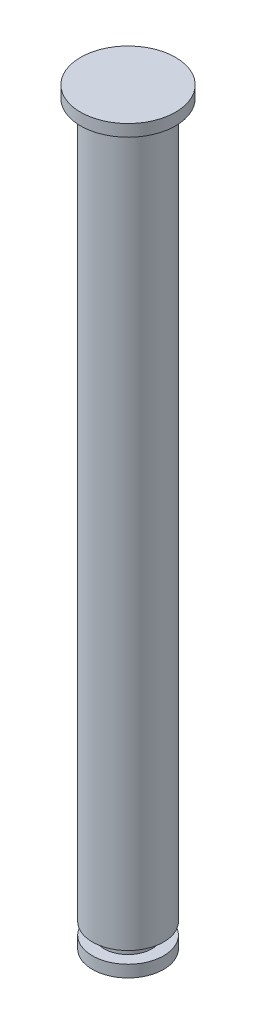
ISO-10303-21;
HEADER;
FILE_DESCRIPTION(('STEP AP214'),'2;1');
FILE_NAME('part.step','',(''),(''),'','','');
FILE_SCHEMA(('AUTOMOTIVE_DESIGN { 1 0 10303 214 1 1 1 1 }'));
ENDSEC;
DATA;
#1=APPLICATION_CONTEXT('core data for automotive mechanical design processes');
#2=APPLICATION_PROTOCOL_DEFINITION('international standard','automotive_design',2000,#1);
#3=PRODUCT_CONTEXT('',#1,'mechanical');
#4=PRODUCT('Part','Part','',(#3));
#5=PRODUCT_RELATED_PRODUCT_CATEGORY('part','',(#4));
#6=PRODUCT_DEFINITION_FORMATION('','',#4);
#7=PRODUCT_DEFINITION_CONTEXT('part definition',#1,'design');
#8=PRODUCT_DEFINITION('design','',#6,#7);
#9=PRODUCT_DEFINITION_SHAPE('','',#8);
#10=(LENGTH_UNIT() NAMED_UNIT(*) SI_UNIT(.MILLI.,.METRE.));
#11=(NAMED_UNIT(*) PLANE_ANGLE_UNIT() SI_UNIT($,.RADIAN.));
#12=(NAMED_UNIT(*) SI_UNIT($,.STERADIAN.) SOLID_ANGLE_UNIT());
#13=UNCERTAINTY_MEASURE_WITH_UNIT(LENGTH_MEASURE(1.E-05),#10,'distance_accuracy_value','');
#14=(GEOMETRIC_REPRESENTATION_CONTEXT(3) GLOBAL_UNCERTAINTY_ASSIGNED_CONTEXT((#13)) GLOBAL_UNIT_ASSIGNED_CONTEXT((#10,
#11,#12)) REPRESENTATION_CONTEXT('',''));
#15=CARTESIAN_POINT('',(0.,0.,0.));
#16=DIRECTION('',(0.,0.,1.));
#17=DIRECTION('',(1.,0.,0.));
#18=AXIS2_PLACEMENT_3D('',#15,#16,#17);
#19=CARTESIAN_POINT('',(0.,63.,0.));
#20=DIRECTION('',(0.,1.,0.));
#21=DIRECTION('',(0.,0.,1.));
#22=AXIS2_PLACEMENT_3D('',#19,#20,#21);
#23=PLANE('',#22);
#24=CARTESIAN_POINT('',(0.,63.,0.));
#25=DIRECTION('',(0.,-1.,0.));
#26=DIRECTION('',(0.,0.,-1.));
#27=AXIS2_PLACEMENT_3D('',#24,#25,#26);
#28=CIRCLE('',#27,4.);
#29=CARTESIAN_POINT('',(0.,63.,-4.));
#30=VERTEX_POINT('',#29);
#31=EDGE_CURVE('E12',#30,#30,#28,.T.);
#32=ORIENTED_EDGE('',*,*,#31,.F.);
#33=EDGE_LOOP('',(#32));
#34=FACE_BOUND('',#33,.T.);
#35=ADVANCED_FACE('F51',(#34),#23,.T.);
#36=CARTESIAN_POINT('',(0.,0.,0.));
#37=DIRECTION('',(0.,-1.,0.));
#38=DIRECTION('',(0.,0.,-1.));
#39=AXIS2_PLACEMENT_3D('',#36,#37,#38);
#40=CYLINDRICAL_SURFACE('',#39,4.);
#41=ORIENTED_EDGE('',*,*,#31,.T.);
#42=EDGE_LOOP('',(#41));
#43=FACE_BOUND('',#42,.T.);
#44=CARTESIAN_POINT('',(0.,62.,0.));
#45=DIRECTION('',(0.,-1.,0.));
#46=DIRECTION('',(0.,0.,-1.));
#47=AXIS2_PLACEMENT_3D('',#44,#45,#46);
#48=CIRCLE('',#47,4.);
#49=CARTESIAN_POINT('',(0.,62.,-4.));
#50=VERTEX_POINT('',#49);
#51=EDGE_CURVE('E57',#50,#50,#48,.T.);
#52=ORIENTED_EDGE('',*,*,#51,.F.);
#53=EDGE_LOOP('',(#52));
#54=FACE_BOUND('',#53,.T.);
#55=ADVANCED_FACE('F100',(#43,#54),#40,.T.);
#56=CARTESIAN_POINT('',(0.,62.,-4.));
#57=DIRECTION('',(0.,-1.,0.));
#58=DIRECTION('',(0.,0.,-1.));
#59=AXIS2_PLACEMENT_3D('',#56,#57,#58);
#60=PLANE('',#59);
#61=ORIENTED_EDGE('',*,*,#51,.T.);
#62=EDGE_LOOP('',(#61));
#63=FACE_BOUND('',#62,.T.);
#64=CARTESIAN_POINT('',(0.,62.,0.));
#65=DIRECTION('',(0.,-1.,0.));
#66=DIRECTION('',(0.,0.,-1.));
#67=AXIS2_PLACEMENT_3D('',#64,#65,#66);
#68=CIRCLE('',#67,3.);
#69=CARTESIAN_POINT('',(0.,62.,-3.));
#70=VERTEX_POINT('',#69);
#71=EDGE_CURVE('E61',#70,#70,#68,.T.);
#72=ORIENTED_EDGE('',*,*,#71,.F.);
#73=EDGE_LOOP('',(#72));
#74=FACE_BOUND('',#73,.T.);
#75=ADVANCED_FACE('F94',(#63,#74),#60,.T.);
#76=CARTESIAN_POINT('',(0.,0.,0.));
#77=DIRECTION('',(0.,-1.,0.));
#78=DIRECTION('',(0.,0.,-1.));
#79=AXIS2_PLACEMENT_3D('',#76,#77,#78);
#80=CYLINDRICAL_SURFACE('',#79,3.00000000000001);
#81=CARTESIAN_POINT('',(0.,2.00000000000001,0.));
#82=DIRECTION('',(0.,-1.,0.));
#83=DIRECTION('',(0.,0.,-1.));
#84=AXIS2_PLACEMENT_3D('',#81,#82,#83);
#85=CIRCLE('',#84,3.00000000000001);
#86=CARTESIAN_POINT('',(0.,2.00000000000001,-3.00000000000001));
#87=VERTEX_POINT('',#86);
#88=EDGE_CURVE('E83',#87,#87,#85,.T.);
#89=ORIENTED_EDGE('',*,*,#88,.F.);
#90=EDGE_LOOP('',(#89));
#91=FACE_BOUND('',#90,.T.);
#92=ORIENTED_EDGE('',*,*,#71,.T.);
#93=EDGE_LOOP('',(#92));
#94=FACE_BOUND('',#93,.T.);
#95=ADVANCED_FACE('F90',(#91,#94),#80,.T.);
#96=CARTESIAN_POINT('',(3.,1.,0.));
#97=DIRECTION('',(0.,-1.,0.));
#98=DIRECTION('',(0.,0.,-1.));
#99=AXIS2_PLACEMENT_3D('',#96,#97,#98);
#100=PLANE('',#99);
#101=CARTESIAN_POINT('',(0.,1.,0.));
#102=DIRECTION('',(0.,-1.,0.));
#103=DIRECTION('',(0.,0.,-1.));
#104=AXIS2_PLACEMENT_3D('',#101,#102,#103);
#105=CIRCLE('',#104,3.00000000000001);
#106=CARTESIAN_POINT('',(0.,1.,-3.00000000000001));
#107=VERTEX_POINT('',#106);
#108=EDGE_CURVE('E71',#107,#107,#105,.T.);
#109=ORIENTED_EDGE('',*,*,#108,.F.);
#110=EDGE_LOOP('',(#109));
#111=FACE_BOUND('',#110,.T.);
#112=CARTESIAN_POINT('',(0.,1.,0.));
#113=DIRECTION('',(0.,-1.,0.));
#114=DIRECTION('',(0.,0.,-1.));
#115=AXIS2_PLACEMENT_3D('',#112,#113,#114);
#116=CIRCLE('',#115,2.00000000000001);
#117=CARTESIAN_POINT('',(0.,1.,-2.00000000000001));
#118=VERTEX_POINT('',#117);
#119=EDGE_CURVE('E75',#118,#118,#116,.T.);
#120=ORIENTED_EDGE('',*,*,#119,.T.);
#121=EDGE_LOOP('',(#120));
#122=FACE_BOUND('',#121,.T.);
#123=ADVANCED_FACE('F93',(#111,#122),#100,.F.);
#124=CARTESIAN_POINT('',(0.,0.,0.));
#125=DIRECTION('',(0.,-1.,0.));
#126=DIRECTION('',(0.,0.,-1.));
#127=AXIS2_PLACEMENT_3D('',#124,#125,#126);
#128=CYLINDRICAL_SURFACE('',#127,2.00000000000001);
#129=ORIENTED_EDGE('',*,*,#119,.F.);
#130=EDGE_LOOP('',(#129));
#131=FACE_BOUND('',#130,.T.);
#132=CARTESIAN_POINT('',(0.,2.00000000000001,0.));
#133=DIRECTION('',(0.,-1.,0.));
#134=DIRECTION('',(0.,0.,-1.));
#135=AXIS2_PLACEMENT_3D('',#132,#133,#134);
#136=CIRCLE('',#135,2.00000000000001);
#137=CARTESIAN_POINT('',(0.,2.00000000000001,-2.00000000000001));
#138=VERTEX_POINT('',#137);
#139=EDGE_CURVE('E79',#138,#138,#136,.T.);
#140=ORIENTED_EDGE('',*,*,#139,.T.);
#141=EDGE_LOOP('',(#140));
#142=FACE_BOUND('',#141,.T.);
#143=ADVANCED_FACE('F141',(#131,#142),#128,.T.);
#144=CARTESIAN_POINT('',(3.,2.00000000000001,0.));
#145=DIRECTION('',(0.,1.,0.));
#146=DIRECTION('',(0.,0.,1.));
#147=AXIS2_PLACEMENT_3D('',#144,#145,#146);
#148=PLANE('',#147);
#149=ORIENTED_EDGE('',*,*,#139,.F.);
#150=EDGE_LOOP('',(#149));
#151=FACE_BOUND('',#150,.T.);
#152=ORIENTED_EDGE('',*,*,#88,.T.);
#153=EDGE_LOOP('',(#152));
#154=FACE_BOUND('',#153,.T.);
#155=ADVANCED_FACE('F88',(#151,#154),#148,.F.);
#156=CARTESIAN_POINT('',(0.,0.,-3.00000000000001));
#157=DIRECTION('',(0.,-1.,0.));
#158=DIRECTION('',(0.,0.,-1.));
#159=AXIS2_PLACEMENT_3D('',#156,#157,#158);
#160=PLANE('',#159);
#161=CARTESIAN_POINT('',(0.,0.,0.));
#162=DIRECTION('',(0.,-1.,0.));
#163=DIRECTION('',(0.,0.,-1.));
#164=AXIS2_PLACEMENT_3D('',#161,#162,#163);
#165=CIRCLE('',#164,3.00000000000001);
#166=CARTESIAN_POINT('',(0.,0.,-3.00000000000001));
#167=VERTEX_POINT('',#166);
#168=EDGE_CURVE('E65',#167,#167,#165,.T.);
#169=ORIENTED_EDGE('',*,*,#168,.T.);
#170=EDGE_LOOP('',(#169));
#171=FACE_BOUND('',#170,.T.);
#172=ADVANCED_FACE('F122',(#171),#160,.T.);
#173=ORIENTED_EDGE('',*,*,#108,.T.);
#174=EDGE_LOOP('',(#173));
#175=FACE_BOUND('',#174,.T.);
#176=ORIENTED_EDGE('',*,*,#168,.F.);
#177=EDGE_LOOP('',(#176));
#178=FACE_BOUND('',#177,.T.);
#179=ADVANCED_FACE('F96',(#175,#178),#80,.T.);
#180=CLOSED_SHELL('',(#35,#55,#75,#95,#123,#143,#155,#172,#179));
#181=MANIFOLD_SOLID_BREP('B2',#180);
#182=ADVANCED_BREP_SHAPE_REPRESENTATION('',(#18,#181),#14);
#183=SHAPE_DEFINITION_REPRESENTATION(#9,#182);
ENDSEC;
END-ISO-10303-21;
